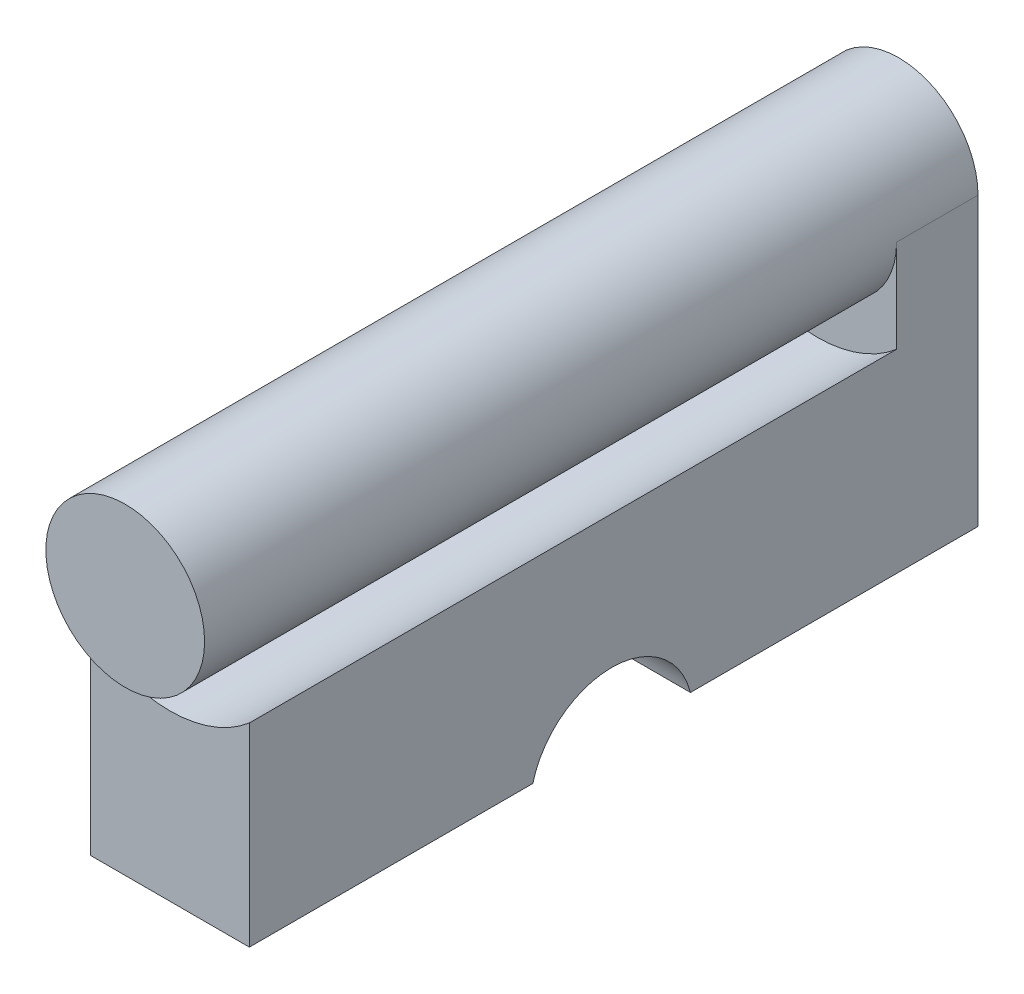
ISO-10303-21;
HEADER;
FILE_DESCRIPTION(('STEP AP214'),'2;1');
FILE_NAME('part.step','',(''),(''),'','','');
FILE_SCHEMA(('AUTOMOTIVE_DESIGN { 1 0 10303 214 1 1 1 1 }'));
ENDSEC;
DATA;
#1=APPLICATION_CONTEXT('core data for automotive mechanical design processes');
#2=APPLICATION_PROTOCOL_DEFINITION('international standard','automotive_design',2000,#1);
#3=PRODUCT_CONTEXT('',#1,'mechanical');
#4=PRODUCT('Part','Part','',(#3));
#5=PRODUCT_RELATED_PRODUCT_CATEGORY('part','',(#4));
#6=PRODUCT_DEFINITION_FORMATION('','',#4);
#7=PRODUCT_DEFINITION_CONTEXT('part definition',#1,'design');
#8=PRODUCT_DEFINITION('design','',#6,#7);
#9=PRODUCT_DEFINITION_SHAPE('','',#8);
#10=(LENGTH_UNIT() NAMED_UNIT(*) SI_UNIT(.MILLI.,.METRE.));
#11=(NAMED_UNIT(*) PLANE_ANGLE_UNIT() SI_UNIT($,.RADIAN.));
#12=(NAMED_UNIT(*) SI_UNIT($,.STERADIAN.) SOLID_ANGLE_UNIT());
#13=UNCERTAINTY_MEASURE_WITH_UNIT(LENGTH_MEASURE(1.E-05),#10,'distance_accuracy_value','');
#14=(GEOMETRIC_REPRESENTATION_CONTEXT(3) GLOBAL_UNCERTAINTY_ASSIGNED_CONTEXT((#13)) GLOBAL_UNIT_ASSIGNED_CONTEXT((#10,
#11,#12)) REPRESENTATION_CONTEXT('',''));
#15=CARTESIAN_POINT('',(0.,0.,0.));
#16=DIRECTION('',(0.,0.,1.));
#17=DIRECTION('',(1.,0.,0.));
#18=AXIS2_PLACEMENT_3D('',#15,#16,#17);
#19=CARTESIAN_POINT('',(1.95,-7.05,2.));
#20=DIRECTION('',(0.,1.,0.));
#21=DIRECTION('',(0.,0.,1.));
#22=AXIS2_PLACEMENT_3D('',#19,#20,#21);
#23=PLANE('',#22);
#24=DIRECTION('',(0.,0.,-1.));
#25=VECTOR('',#24,1.);
#26=CARTESIAN_POINT('',(1.95,-7.05,2.));
#27=LINE('',#26,#25);
#28=CARTESIAN_POINT('',(1.95,-7.05,7.06350832689629));
#29=VERTEX_POINT('',#28);
#30=CARTESIAN_POINT('',(1.95,-7.05,0.));
#31=VERTEX_POINT('',#30);
#32=EDGE_CURVE('E190',#29,#31,#27,.T.);
#33=ORIENTED_EDGE('',*,*,#32,.F.);
#34=DIRECTION('',(-1.,0.,0.));
#35=VECTOR('',#34,1.);
#36=CARTESIAN_POINT('',(15.05,-7.05,7.06350832689629));
#37=LINE('',#36,#35);
#38=CARTESIAN_POINT('',(-1.95,-7.05,7.06350832689629));
#39=VERTEX_POINT('',#38);
#40=EDGE_CURVE('E12',#29,#39,#37,.T.);
#41=ORIENTED_EDGE('',*,*,#40,.T.);
#42=DIRECTION('',(0.,0.,-1.));
#43=VECTOR('',#42,1.);
#44=CARTESIAN_POINT('',(-1.95,-7.05,2.));
#45=LINE('',#44,#43);
#46=CARTESIAN_POINT('',(-1.95,-7.05,0.));
#47=VERTEX_POINT('',#46);
#48=EDGE_CURVE('E139',#39,#47,#45,.T.);
#49=ORIENTED_EDGE('',*,*,#48,.T.);
#50=DIRECTION('',(-1.,0.,0.));
#51=VECTOR('',#50,1.);
#52=CARTESIAN_POINT('',(1.95,-7.05,0.));
#53=LINE('',#52,#51);
#54=EDGE_CURVE('E157',#31,#47,#53,.T.);
#55=ORIENTED_EDGE('',*,*,#54,.F.);
#56=EDGE_LOOP('',(#33,#41,#49,#55));
#57=FACE_BOUND('',#56,.T.);
#58=ADVANCED_FACE('F59',(#57),#23,.F.);
#59=CARTESIAN_POINT('',(0.,0.,0.));
#60=DIRECTION('',(0.,0.,1.));
#61=DIRECTION('',(1.,0.,0.));
#62=AXIS2_PLACEMENT_3D('',#59,#60,#61);
#63=PLANE('',#62);
#64=CARTESIAN_POINT('',(0.,0.,0.));
#65=DIRECTION('',(0.,0.,1.));
#66=DIRECTION('',(1.,0.,0.));
#67=AXIS2_PLACEMENT_3D('',#64,#65,#66);
#68=CIRCLE('',#67,1.95);
#69=CARTESIAN_POINT('',(1.95,0.,0.));
#70=VERTEX_POINT('',#69);
#71=CARTESIAN_POINT('',(-1.95,0.,0.));
#72=VERTEX_POINT('',#71);
#73=EDGE_CURVE('E185',#70,#72,#68,.T.);
#74=ORIENTED_EDGE('',*,*,#73,.F.);
#75=DIRECTION('',(0.,1.,0.));
#76=VECTOR('',#75,1.);
#77=CARTESIAN_POINT('',(1.95,1.95,0.));
#78=LINE('',#77,#76);
#79=EDGE_CURVE('E147',#31,#70,#78,.T.);
#80=ORIENTED_EDGE('',*,*,#79,.F.);
#81=ORIENTED_EDGE('',*,*,#54,.T.);
#82=DIRECTION('',(0.,1.,0.));
#83=VECTOR('',#82,1.);
#84=CARTESIAN_POINT('',(-1.95,1.95,0.));
#85=LINE('',#84,#83);
#86=EDGE_CURVE('E181',#47,#72,#85,.T.);
#87=ORIENTED_EDGE('',*,*,#86,.T.);
#88=EDGE_LOOP('',(#74,#80,#81,#87));
#89=FACE_BOUND('',#88,.T.);
#90=ADVANCED_FACE('F228',(#89),#63,.F.);
#91=CARTESIAN_POINT('',(1.95,0.,0.));
#92=DIRECTION('',(1.,0.,0.));
#93=DIRECTION('',(0.,0.,-1.));
#94=AXIS2_PLACEMENT_3D('',#91,#92,#93);
#95=PLANE('',#94);
#96=CARTESIAN_POINT('',(1.95,-7.55,9.));
#97=DIRECTION('',(1.,0.,0.));
#98=DIRECTION('',(0.,0.,-1.));
#99=AXIS2_PLACEMENT_3D('',#96,#97,#98);
#100=CIRCLE('',#99,2.);
#101=CARTESIAN_POINT('',(1.95,-7.05,10.9364916731037));
#102=VERTEX_POINT('',#101);
#103=EDGE_CURVE('E75',#29,#102,#100,.T.);
#104=ORIENTED_EDGE('',*,*,#103,.F.);
#105=ORIENTED_EDGE('',*,*,#32,.T.);
#106=ORIENTED_EDGE('',*,*,#79,.T.);
#107=DIRECTION('',(0.,0.,1.));
#108=VECTOR('',#107,1.);
#109=CARTESIAN_POINT('',(1.95,0.,0.));
#110=LINE('',#109,#108);
#111=CARTESIAN_POINT('',(1.95,0.,2.));
#112=VERTEX_POINT('',#111);
#113=EDGE_CURVE('E83',#70,#112,#110,.T.);
#114=ORIENTED_EDGE('',*,*,#113,.T.);
#115=DIRECTION('',(0.,-1.,0.));
#116=VECTOR('',#115,1.);
#117=CARTESIAN_POINT('',(1.95,1.95,2.));
#118=LINE('',#117,#116);
#119=CARTESIAN_POINT('',(1.95,-2.2798026230356,2.));
#120=VERTEX_POINT('',#119);
#121=EDGE_CURVE('E151',#112,#120,#118,.T.);
#122=ORIENTED_EDGE('',*,*,#121,.T.);
#123=DIRECTION('',(0.,0.,-1.));
#124=VECTOR('',#123,1.);
#125=CARTESIAN_POINT('',(1.95,-2.2798026230356,17.9));
#126=LINE('',#125,#124);
#127=CARTESIAN_POINT('',(1.95,-2.2798026230356,17.9));
#128=VERTEX_POINT('',#127);
#129=EDGE_CURVE('E199',#128,#120,#126,.T.);
#130=ORIENTED_EDGE('',*,*,#129,.F.);
#131=DIRECTION('',(0.,1.,0.));
#132=VECTOR('',#131,1.);
#133=CARTESIAN_POINT('',(1.95,0.,17.9));
#134=LINE('',#133,#132);
#135=CARTESIAN_POINT('',(1.95,-7.05,17.9));
#136=VERTEX_POINT('',#135);
#137=EDGE_CURVE('E202',#136,#128,#134,.T.);
#138=ORIENTED_EDGE('',*,*,#137,.F.);
#139=EDGE_CURVE('E162',#136,#102,#27,.T.);
#140=ORIENTED_EDGE('',*,*,#139,.T.);
#141=EDGE_LOOP('',(#104,#105,#106,#114,#122,#130,#138,#140));
#142=FACE_BOUND('',#141,.T.);
#143=ADVANCED_FACE('F225',(#142),#95,.T.);
#144=CARTESIAN_POINT('',(-1.95,0.,0.));
#145=DIRECTION('',(1.,0.,0.));
#146=DIRECTION('',(0.,0.,-1.));
#147=AXIS2_PLACEMENT_3D('',#144,#145,#146);
#148=PLANE('',#147);
#149=ORIENTED_EDGE('',*,*,#48,.F.);
#150=CARTESIAN_POINT('',(-1.95,-7.55,9.));
#151=DIRECTION('',(-1.,0.,0.));
#152=DIRECTION('',(0.,0.,1.));
#153=AXIS2_PLACEMENT_3D('',#150,#151,#152);
#154=CIRCLE('',#153,2.);
#155=CARTESIAN_POINT('',(-1.95,-7.05,10.9364916731037));
#156=VERTEX_POINT('',#155);
#157=EDGE_CURVE('E126',#156,#39,#154,.T.);
#158=ORIENTED_EDGE('',*,*,#157,.F.);
#159=CARTESIAN_POINT('',(-1.95,-7.05,17.9));
#160=VERTEX_POINT('',#159);
#161=EDGE_CURVE('E136',#160,#156,#45,.T.);
#162=ORIENTED_EDGE('',*,*,#161,.F.);
#163=DIRECTION('',(0.,-1.,0.));
#164=VECTOR('',#163,1.);
#165=CARTESIAN_POINT('',(-1.95,0.,17.9));
#166=LINE('',#165,#164);
#167=CARTESIAN_POINT('',(-1.95,-2.2798026230356,17.9));
#168=VERTEX_POINT('',#167);
#169=EDGE_CURVE('E211',#168,#160,#166,.T.);
#170=ORIENTED_EDGE('',*,*,#169,.F.);
#171=DIRECTION('',(0.,0.,-1.));
#172=VECTOR('',#171,1.);
#173=CARTESIAN_POINT('',(-1.95,-2.2798026230356,17.9));
#174=LINE('',#173,#172);
#175=CARTESIAN_POINT('',(-1.95,-2.2798026230356,2.));
#176=VERTEX_POINT('',#175);
#177=EDGE_CURVE('E178',#168,#176,#174,.T.);
#178=ORIENTED_EDGE('',*,*,#177,.T.);
#179=DIRECTION('',(0.,-1.,0.));
#180=VECTOR('',#179,1.);
#181=CARTESIAN_POINT('',(-1.95,1.95,2.));
#182=LINE('',#181,#180);
#183=CARTESIAN_POINT('',(-1.95,0.,2.));
#184=VERTEX_POINT('',#183);
#185=EDGE_CURVE('E153',#184,#176,#182,.T.);
#186=ORIENTED_EDGE('',*,*,#185,.F.);
#187=DIRECTION('',(0.,0.,1.));
#188=VECTOR('',#187,1.);
#189=CARTESIAN_POINT('',(-1.95,0.,0.));
#190=LINE('',#189,#188);
#191=EDGE_CURVE('E176',#72,#184,#190,.T.);
#192=ORIENTED_EDGE('',*,*,#191,.F.);
#193=ORIENTED_EDGE('',*,*,#86,.F.);
#194=EDGE_LOOP('',(#149,#158,#162,#170,#178,#186,#192,#193));
#195=FACE_BOUND('',#194,.T.);
#196=ADVANCED_FACE('F134',(#195),#148,.F.);
#197=CARTESIAN_POINT('',(0.,0.,19.));
#198=DIRECTION('',(0.,0.,-1.));
#199=DIRECTION('',(-1.,0.,0.));
#200=AXIS2_PLACEMENT_3D('',#197,#198,#199);
#201=CYLINDRICAL_SURFACE('',#200,1.95);
#202=CARTESIAN_POINT('',(0.,0.,2.));
#203=DIRECTION('',(0.,0.,-1.));
#204=DIRECTION('',(0.,1.,0.));
#205=AXIS2_PLACEMENT_3D('',#202,#203,#204);
#206=CIRCLE('',#205,1.95);
#207=EDGE_CURVE('E131',#112,#184,#206,.T.);
#208=ORIENTED_EDGE('',*,*,#207,.F.);
#209=ORIENTED_EDGE('',*,*,#113,.F.);
#210=ORIENTED_EDGE('',*,*,#73,.T.);
#211=ORIENTED_EDGE('',*,*,#191,.T.);
#212=EDGE_LOOP('',(#208,#209,#210,#211));
#213=FACE_BOUND('',#212,.T.);
#214=CARTESIAN_POINT('',(0.,0.,19.));
#215=DIRECTION('',(0.,0.,1.));
#216=DIRECTION('',(1.,0.,0.));
#217=AXIS2_PLACEMENT_3D('',#214,#215,#216);
#218=CIRCLE('',#217,1.95);
#219=CARTESIAN_POINT('',(1.95,0.,19.));
#220=VERTEX_POINT('',#219);
#221=EDGE_CURVE('E161',#220,#220,#218,.T.);
#222=ORIENTED_EDGE('',*,*,#221,.F.);
#223=EDGE_LOOP('',(#222));
#224=FACE_BOUND('',#223,.T.);
#225=ADVANCED_FACE('F61',(#213,#224),#201,.T.);
#226=CARTESIAN_POINT('',(0.,0.,19.));
#227=DIRECTION('',(0.,0.,1.));
#228=DIRECTION('',(1.,0.,0.));
#229=AXIS2_PLACEMENT_3D('',#226,#227,#228);
#230=PLANE('',#229);
#231=ORIENTED_EDGE('',*,*,#221,.T.);
#232=EDGE_LOOP('',(#231));
#233=FACE_BOUND('',#232,.T.);
#234=ADVANCED_FACE('F247',(#233),#230,.T.);
#235=CARTESIAN_POINT('',(1.95,1.95,2.));
#236=DIRECTION('',(0.,0.,-1.));
#237=DIRECTION('',(0.,1.,0.));
#238=AXIS2_PLACEMENT_3D('',#235,#236,#237);
#239=PLANE('',#238);
#240=ORIENTED_EDGE('',*,*,#185,.T.);
#241=CARTESIAN_POINT('',(0.,0.,2.));
#242=DIRECTION('',(0.,0.,1.));
#243=DIRECTION('',(1.,0.,0.));
#244=AXIS2_PLACEMENT_3D('',#241,#242,#243);
#245=CIRCLE('',#244,3.);
#246=EDGE_CURVE('E203',#176,#120,#245,.T.);
#247=ORIENTED_EDGE('',*,*,#246,.T.);
#248=ORIENTED_EDGE('',*,*,#121,.F.);
#249=ORIENTED_EDGE('',*,*,#207,.T.);
#250=EDGE_LOOP('',(#240,#247,#248,#249));
#251=FACE_BOUND('',#250,.T.);
#252=ADVANCED_FACE('F172',(#251),#239,.F.);
#253=ORIENTED_EDGE('',*,*,#161,.T.);
#254=DIRECTION('',(-1.,0.,0.));
#255=VECTOR('',#254,1.);
#256=CARTESIAN_POINT('',(15.05,-7.05,10.9364916731037));
#257=LINE('',#256,#255);
#258=EDGE_CURVE('E68',#156,#102,#257,.F.);
#259=ORIENTED_EDGE('',*,*,#258,.T.);
#260=ORIENTED_EDGE('',*,*,#139,.F.);
#261=DIRECTION('',(1.,0.,0.));
#262=VECTOR('',#261,1.);
#263=CARTESIAN_POINT('',(0.,-7.05,17.9));
#264=LINE('',#263,#262);
#265=EDGE_CURVE('E145',#160,#136,#264,.T.);
#266=ORIENTED_EDGE('',*,*,#265,.F.);
#267=EDGE_LOOP('',(#253,#259,#260,#266));
#268=FACE_BOUND('',#267,.T.);
#269=ADVANCED_FACE('F143',(#268),#23,.F.);
#270=CARTESIAN_POINT('',(0.,0.,17.9));
#271=DIRECTION('',(0.,0.,-1.));
#272=DIRECTION('',(-1.,0.,0.));
#273=AXIS2_PLACEMENT_3D('',#270,#271,#272);
#274=CYLINDRICAL_SURFACE('',#273,3.);
#275=ORIENTED_EDGE('',*,*,#246,.F.);
#276=ORIENTED_EDGE('',*,*,#177,.F.);
#277=CARTESIAN_POINT('',(0.,0.,17.9));
#278=DIRECTION('',(0.,0.,1.));
#279=DIRECTION('',(1.,0.,0.));
#280=AXIS2_PLACEMENT_3D('',#277,#278,#279);
#281=CIRCLE('',#280,3.);
#282=EDGE_CURVE('E206',#168,#128,#281,.T.);
#283=ORIENTED_EDGE('',*,*,#282,.T.);
#284=ORIENTED_EDGE('',*,*,#129,.T.);
#285=EDGE_LOOP('',(#275,#276,#283,#284));
#286=FACE_BOUND('',#285,.T.);
#287=ADVANCED_FACE('F220',(#286),#274,.F.);
#288=CARTESIAN_POINT('',(0.,0.,17.9));
#289=DIRECTION('',(0.,0.,1.));
#290=DIRECTION('',(1.,0.,0.));
#291=AXIS2_PLACEMENT_3D('',#288,#289,#290);
#292=PLANE('',#291);
#293=ORIENTED_EDGE('',*,*,#282,.F.);
#294=ORIENTED_EDGE('',*,*,#169,.T.);
#295=ORIENTED_EDGE('',*,*,#265,.T.);
#296=ORIENTED_EDGE('',*,*,#137,.T.);
#297=EDGE_LOOP('',(#293,#294,#295,#296));
#298=FACE_BOUND('',#297,.T.);
#299=ADVANCED_FACE('F223',(#298),#292,.T.);
#300=CARTESIAN_POINT('',(15.05,-7.55,9.));
#301=DIRECTION('',(-1.,0.,0.));
#302=DIRECTION('',(0.,0.,1.));
#303=AXIS2_PLACEMENT_3D('',#300,#301,#302);
#304=CYLINDRICAL_SURFACE('',#303,2.);
#305=ORIENTED_EDGE('',*,*,#103,.T.);
#306=ORIENTED_EDGE('',*,*,#258,.F.);
#307=ORIENTED_EDGE('',*,*,#157,.T.);
#308=ORIENTED_EDGE('',*,*,#40,.F.);
#309=EDGE_LOOP('',(#305,#306,#307,#308));
#310=FACE_BOUND('',#309,.T.);
#311=ADVANCED_FACE('F125',(#310),#304,.F.);
#312=CLOSED_SHELL('',(#58,#90,#143,#196,#225,#234,#252,#269,#287,#299,#311));
#313=MANIFOLD_SOLID_BREP('B2',#312);
#314=ADVANCED_BREP_SHAPE_REPRESENTATION('',(#18,#313),#14);
#315=SHAPE_DEFINITION_REPRESENTATION(#9,#314);
ENDSEC;
END-ISO-10303-21;
